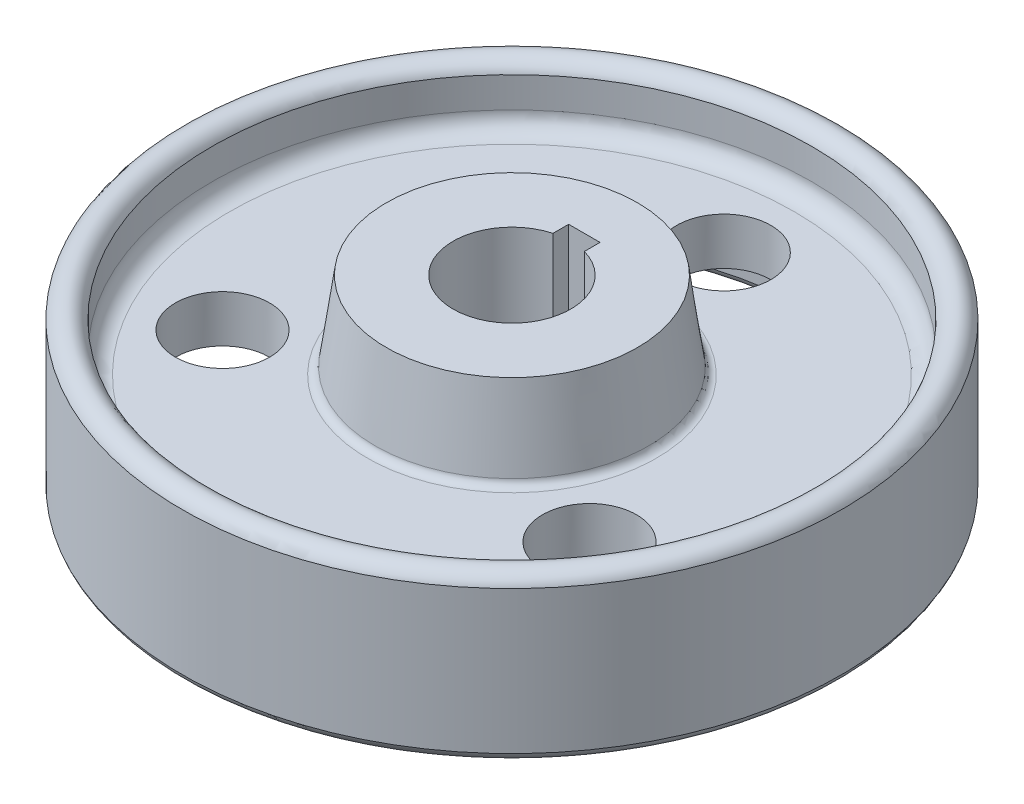
ISO-10303-21;
HEADER;
FILE_DESCRIPTION(('STEP AP214'),'2;1');
FILE_NAME('part.step','',(''),(''),'','','');
FILE_SCHEMA(('AUTOMOTIVE_DESIGN { 1 0 10303 214 1 1 1 1 }'));
ENDSEC;
DATA;
#1=APPLICATION_CONTEXT('core data for automotive mechanical design processes');
#2=APPLICATION_PROTOCOL_DEFINITION('international standard','automotive_design',2000,#1);
#3=PRODUCT_CONTEXT('',#1,'mechanical');
#4=PRODUCT('Part','Part','',(#3));
#5=PRODUCT_RELATED_PRODUCT_CATEGORY('part','',(#4));
#6=PRODUCT_DEFINITION_FORMATION('','',#4);
#7=PRODUCT_DEFINITION_CONTEXT('part definition',#1,'design');
#8=PRODUCT_DEFINITION('design','',#6,#7);
#9=PRODUCT_DEFINITION_SHAPE('','',#8);
#10=(LENGTH_UNIT() NAMED_UNIT(*) SI_UNIT(.MILLI.,.METRE.));
#11=(NAMED_UNIT(*) PLANE_ANGLE_UNIT() SI_UNIT($,.RADIAN.));
#12=(NAMED_UNIT(*) SI_UNIT($,.STERADIAN.) SOLID_ANGLE_UNIT());
#13=UNCERTAINTY_MEASURE_WITH_UNIT(LENGTH_MEASURE(1.E-05),#10,'distance_accuracy_value','');
#14=(GEOMETRIC_REPRESENTATION_CONTEXT(3) GLOBAL_UNCERTAINTY_ASSIGNED_CONTEXT((#13)) GLOBAL_UNIT_ASSIGNED_CONTEXT((#10,
#11,#12)) REPRESENTATION_CONTEXT('',''));
#15=CARTESIAN_POINT('',(0.,0.,0.));
#16=DIRECTION('',(0.,0.,1.));
#17=DIRECTION('',(1.,0.,0.));
#18=AXIS2_PLACEMENT_3D('',#15,#16,#17);
#19=CARTESIAN_POINT('',(0.,-13.4326206780507,0.));
#20=DIRECTION('',(0.,-1.,0.));
#21=DIRECTION('',(0.,0.,-1.));
#22=AXIS2_PLACEMENT_3D('',#19,#20,#21);
#23=TOROIDAL_SURFACE('',#22,63.6699438496003,3.175);
#24=CARTESIAN_POINT('',(0.,-14.4574438496003,0.));
#25=DIRECTION('',(0.,-1.,0.));
#26=DIRECTION('',(0.,0.,-1.));
#27=AXIS2_PLACEMENT_3D('',#24,#25,#26);
#28=CIRCLE('',#27,60.6648876992006);
#29=CARTESIAN_POINT('',(0.,-14.4574438496003,-60.6648876992006));
#30=VERTEX_POINT('',#29);
#31=EDGE_CURVE('E11',#30,#30,#28,.T.);
#32=ORIENTED_EDGE('',*,*,#31,.F.);
#33=EDGE_LOOP('',(#32));
#34=FACE_BOUND('',#33,.T.);
#35=CARTESIAN_POINT('',(0.,-14.4574438496003,0.));
#36=DIRECTION('',(0.,-1.,0.));
#37=DIRECTION('',(0.,0.,-1.));
#38=AXIS2_PLACEMENT_3D('',#35,#36,#37);
#39=CIRCLE('',#38,66.675);
#40=CARTESIAN_POINT('',(0.,-14.4574438496003,-66.675));
#41=VERTEX_POINT('',#40);
#42=EDGE_CURVE('E132',#41,#41,#39,.T.);
#43=ORIENTED_EDGE('',*,*,#42,.T.);
#44=EDGE_LOOP('',(#43));
#45=FACE_BOUND('',#44,.T.);
#46=ADVANCED_FACE('F37',(#34,#45),#23,.T.);
#47=CARTESIAN_POINT('',(0.,0.,0.));
#48=DIRECTION('',(0.,-1.,0.));
#49=DIRECTION('',(0.,0.,-1.));
#50=AXIS2_PLACEMENT_3D('',#47,#48,#49);
#51=CYLINDRICAL_SURFACE('',#50,60.6648876992006);
#52=CARTESIAN_POINT('',(0.,-8.27738769920063,0.));
#53=DIRECTION('',(0.,-1.,0.));
#54=DIRECTION('',(0.,0.,-1.));
#55=AXIS2_PLACEMENT_3D('',#52,#53,#54);
#56=CIRCLE('',#55,60.6648876992006);
#57=CARTESIAN_POINT('',(0.,-8.27738769920063,-60.6648876992006));
#58=VERTEX_POINT('',#57);
#59=EDGE_CURVE('E44',#58,#58,#56,.T.);
#60=ORIENTED_EDGE('',*,*,#59,.F.);
#61=EDGE_LOOP('',(#60));
#62=FACE_BOUND('',#61,.T.);
#63=ORIENTED_EDGE('',*,*,#31,.T.);
#64=EDGE_LOOP('',(#63));
#65=FACE_BOUND('',#64,.T.);
#66=ADVANCED_FACE('F123',(#62,#65),#51,.F.);
#67=CARTESIAN_POINT('',(0.,-8.27738769920063,0.));
#68=DIRECTION('',(0.,-1.,0.));
#69=DIRECTION('',(0.,0.,-1.));
#70=AXIS2_PLACEMENT_3D('',#67,#68,#69);
#71=TOROIDAL_SURFACE('',#70,57.15,3.51488769920063);
#72=ORIENTED_EDGE('',*,*,#59,.T.);
#73=EDGE_LOOP('',(#72));
#74=FACE_BOUND('',#73,.T.);
#75=CARTESIAN_POINT('',(0.,-4.76249999999999,0.));
#76=DIRECTION('',(0.,-1.,0.));
#77=DIRECTION('',(0.,0.,-1.));
#78=AXIS2_PLACEMENT_3D('',#75,#76,#77);
#79=CIRCLE('',#78,57.15);
#80=CARTESIAN_POINT('',(0.,-4.76249999999999,-57.15));
#81=VERTEX_POINT('',#80);
#82=EDGE_CURVE('E115',#81,#81,#79,.T.);
#83=ORIENTED_EDGE('',*,*,#82,.F.);
#84=EDGE_LOOP('',(#83));
#85=FACE_BOUND('',#84,.T.);
#86=ADVANCED_FACE('F120',(#74,#85),#71,.F.);
#87=CARTESIAN_POINT('',(0.,-4.7625,-29.2341870222737));
#88=DIRECTION('',(0.,-1.,0.));
#89=DIRECTION('',(0.,0.,-1.));
#90=AXIS2_PLACEMENT_3D('',#87,#88,#89);
#91=PLANE('',#90);
#92=CARTESIAN_POINT('',(0.,-4.7625,-42.8625));
#93=DIRECTION('',(0.,-1.,0.));
#94=DIRECTION('',(0.,0.,-1.));
#95=AXIS2_PLACEMENT_3D('',#92,#93,#94);
#96=CIRCLE('',#95,9.525);
#97=CARTESIAN_POINT('',(0.,-4.7625,-52.3875));
#98=VERTEX_POINT('',#97);
#99=EDGE_CURVE('E86',#98,#98,#96,.T.);
#100=ORIENTED_EDGE('',*,*,#99,.F.);
#101=EDGE_LOOP('',(#100));
#102=FACE_BOUND('',#101,.T.);
#103=CARTESIAN_POINT('',(-37.1200138697105,-4.7625,21.4312500000001));
#104=DIRECTION('',(0.,-1.,0.));
#105=DIRECTION('',(0.,0.,-1.));
#106=AXIS2_PLACEMENT_3D('',#103,#104,#105);
#107=CIRCLE('',#106,9.525);
#108=CARTESIAN_POINT('',(-37.1200138697105,-4.7625,11.9062500000001));
#109=VERTEX_POINT('',#108);
#110=EDGE_CURVE('E368',#109,#109,#107,.T.);
#111=ORIENTED_EDGE('',*,*,#110,.F.);
#112=EDGE_LOOP('',(#111));
#113=FACE_BOUND('',#112,.T.);
#114=CARTESIAN_POINT('',(37.1200138697105,-4.7625,21.43125));
#115=DIRECTION('',(0.,-1.,0.));
#116=DIRECTION('',(0.,0.,-1.));
#117=AXIS2_PLACEMENT_3D('',#114,#115,#116);
#118=CIRCLE('',#117,9.525);
#119=CARTESIAN_POINT('',(37.1200138697105,-4.7625,11.90625));
#120=VERTEX_POINT('',#119);
#121=EDGE_CURVE('E365',#120,#120,#118,.T.);
#122=ORIENTED_EDGE('',*,*,#121,.F.);
#123=EDGE_LOOP('',(#122));
#124=FACE_BOUND('',#123,.T.);
#125=ORIENTED_EDGE('',*,*,#82,.T.);
#126=EDGE_LOOP('',(#125));
#127=FACE_BOUND('',#126,.T.);
#128=CARTESIAN_POINT('',(0.,-4.76250000000001,0.));
#129=DIRECTION('',(0.,-1.,0.));
#130=DIRECTION('',(0.,0.,-1.));
#131=AXIS2_PLACEMENT_3D('',#128,#129,#130);
#132=CIRCLE('',#131,29.2341870222737);
#133=CARTESIAN_POINT('',(0.,-4.76250000000001,-29.2341870222737));
#134=VERTEX_POINT('',#133);
#135=EDGE_CURVE('E112',#134,#134,#132,.T.);
#136=ORIENTED_EDGE('',*,*,#135,.F.);
#137=EDGE_LOOP('',(#136));
#138=FACE_BOUND('',#137,.T.);
#139=ADVANCED_FACE('F184',(#102,#113,#124,#127,#138),#91,.T.);
#140=CARTESIAN_POINT('',(0.,-6.35000000000002,0.));
#141=DIRECTION('',(0.,-1.,0.));
#142=DIRECTION('',(0.,0.,-1.));
#143=AXIS2_PLACEMENT_3D('',#140,#141,#142);
#144=TOROIDAL_SURFACE('',#143,29.2341870222737,1.58750000000001);
#145=CARTESIAN_POINT('',(0.,-6.12906270222592,0.));
#146=DIRECTION('',(0.,-1.,0.));
#147=DIRECTION('',(0.,0.,-1.));
#148=AXIS2_PLACEMENT_3D('',#145,#146,#147);
#149=CIRCLE('',#148,27.6621364631465);
#150=CARTESIAN_POINT('',(0.,-6.12906270222592,-27.6621364631465));
#151=VERTEX_POINT('',#150);
#152=EDGE_CURVE('E109',#151,#151,#149,.T.);
#153=ORIENTED_EDGE('',*,*,#152,.F.);
#154=EDGE_LOOP('',(#153));
#155=FACE_BOUND('',#154,.T.);
#156=ORIENTED_EDGE('',*,*,#135,.T.);
#157=EDGE_LOOP('',(#156));
#158=FACE_BOUND('',#157,.T.);
#159=ADVANCED_FACE('F180',(#155,#158),#144,.F.);
#160=CARTESIAN_POINT('',(0.,-22.225,0.));
#161=DIRECTION('',(0.,1.,0.));
#162=DIRECTION('',(0.,0.,1.));
#163=AXIS2_PLACEMENT_3D('',#160,#161,#162);
#164=CONICAL_SURFACE('',#163,25.4,0.139626340159544);
#165=ORIENTED_EDGE('',*,*,#152,.T.);
#166=EDGE_LOOP('',(#165));
#167=FACE_BOUND('',#166,.T.);
#168=CARTESIAN_POINT('',(0.,-22.225,0.));
#169=DIRECTION('',(0.,-1.,0.));
#170=DIRECTION('',(0.,0.,-1.));
#171=AXIS2_PLACEMENT_3D('',#168,#169,#170);
#172=CIRCLE('',#171,25.4);
#173=CARTESIAN_POINT('',(0.,-22.225,-25.4));
#174=VERTEX_POINT('',#173);
#175=EDGE_CURVE('E100',#174,#174,#172,.T.);
#176=ORIENTED_EDGE('',*,*,#175,.F.);
#177=EDGE_LOOP('',(#176));
#178=FACE_BOUND('',#177,.T.);
#179=ADVANCED_FACE('F176',(#167,#178),#164,.T.);
#180=CARTESIAN_POINT('',(0.,-22.225,-11.90625));
#181=DIRECTION('',(0.,-1.,0.));
#182=DIRECTION('',(0.,0.,-1.));
#183=AXIS2_PLACEMENT_3D('',#180,#181,#182);
#184=PLANE('',#183);
#185=DIRECTION('',(0.,0.,-1.));
#186=VECTOR('',#185,1.);
#187=CARTESIAN_POINT('',(-3.175,-22.225,-11.90625));
#188=LINE('',#187,#186);
#189=CARTESIAN_POINT('',(-3.175,-22.225,-11.4751106339983));
#190=VERTEX_POINT('',#189);
#191=CARTESIAN_POINT('',(-3.175,-22.225,-14.6501106339983));
#192=VERTEX_POINT('',#191);
#193=EDGE_CURVE('E59',#190,#192,#188,.T.);
#194=ORIENTED_EDGE('',*,*,#193,.F.);
#195=CARTESIAN_POINT('',(0.,-22.225,0.));
#196=DIRECTION('',(0.,-1.,0.));
#197=DIRECTION('',(0.,0.,-1.));
#198=AXIS2_PLACEMENT_3D('',#195,#196,#197);
#199=CIRCLE('',#198,11.90625);
#200=CARTESIAN_POINT('',(3.175,-22.225,-11.4751106339983));
#201=VERTEX_POINT('',#200);
#202=EDGE_CURVE('E94',#201,#190,#199,.T.);
#203=ORIENTED_EDGE('',*,*,#202,.F.);
#204=DIRECTION('',(0.,0.,1.));
#205=VECTOR('',#204,1.);
#206=CARTESIAN_POINT('',(3.175,-22.225,-11.90625));
#207=LINE('',#206,#205);
#208=CARTESIAN_POINT('',(3.175,-22.225,-14.6501106339983));
#209=VERTEX_POINT('',#208);
#210=EDGE_CURVE('E375',#209,#201,#207,.T.);
#211=ORIENTED_EDGE('',*,*,#210,.F.);
#212=DIRECTION('',(1.,0.,0.));
#213=VECTOR('',#212,1.);
#214=CARTESIAN_POINT('',(0.,-22.225,-14.6501106339983));
#215=LINE('',#214,#213);
#216=EDGE_CURVE('E139',#192,#209,#215,.T.);
#217=ORIENTED_EDGE('',*,*,#216,.F.);
#218=EDGE_LOOP('',(#194,#203,#211,#217));
#219=FACE_BOUND('',#218,.T.);
#220=ORIENTED_EDGE('',*,*,#175,.T.);
#221=EDGE_LOOP('',(#220));
#222=FACE_BOUND('',#221,.T.);
#223=ADVANCED_FACE('F170',(#219,#222),#184,.T.);
#224=CARTESIAN_POINT('',(0.,0.,0.));
#225=DIRECTION('',(0.,-1.,0.));
#226=DIRECTION('',(0.,0.,-1.));
#227=AXIS2_PLACEMENT_3D('',#224,#225,#226);
#228=CYLINDRICAL_SURFACE('',#227,11.90625);
#229=ORIENTED_EDGE('',*,*,#202,.T.);
#230=DIRECTION('',(0.,1.,0.));
#231=VECTOR('',#230,1.);
#232=CARTESIAN_POINT('',(-3.175,-104.775,-11.4751106339983));
#233=LINE('',#232,#231);
#234=CARTESIAN_POINT('',(-3.175,22.225,-11.4751106339983));
#235=VERTEX_POINT('',#234);
#236=EDGE_CURVE('E79',#190,#235,#233,.T.);
#237=ORIENTED_EDGE('',*,*,#236,.T.);
#238=CARTESIAN_POINT('',(0.,22.225,0.));
#239=DIRECTION('',(0.,-1.,0.));
#240=DIRECTION('',(0.,0.,-1.));
#241=AXIS2_PLACEMENT_3D('',#238,#239,#240);
#242=CIRCLE('',#241,11.90625);
#243=CARTESIAN_POINT('',(3.175,22.225,-11.4751106339983));
#244=VERTEX_POINT('',#243);
#245=EDGE_CURVE('E92',#244,#235,#242,.T.);
#246=ORIENTED_EDGE('',*,*,#245,.F.);
#247=DIRECTION('',(0.,1.,0.));
#248=VECTOR('',#247,1.);
#249=CARTESIAN_POINT('',(3.175,-104.775,-11.4751106339983));
#250=LINE('',#249,#248);
#251=EDGE_CURVE('E51',#201,#244,#250,.T.);
#252=ORIENTED_EDGE('',*,*,#251,.F.);
#253=EDGE_LOOP('',(#229,#237,#246,#252));
#254=FACE_BOUND('',#253,.T.);
#255=ADVANCED_FACE('F91',(#254),#228,.F.);
#256=CARTESIAN_POINT('',(0.,22.225,-11.90625));
#257=DIRECTION('',(0.,-1.,0.));
#258=DIRECTION('',(0.,0.,-1.));
#259=AXIS2_PLACEMENT_3D('',#256,#257,#258);
#260=PLANE('',#259);
#261=CARTESIAN_POINT('',(0.,22.225,0.));
#262=DIRECTION('',(0.,-1.,0.));
#263=DIRECTION('',(0.,0.,-1.));
#264=AXIS2_PLACEMENT_3D('',#261,#262,#263);
#265=CIRCLE('',#264,25.4);
#266=CARTESIAN_POINT('',(0.,22.225,-25.4));
#267=VERTEX_POINT('',#266);
#268=EDGE_CURVE('E98',#267,#267,#265,.T.);
#269=ORIENTED_EDGE('',*,*,#268,.F.);
#270=EDGE_LOOP('',(#269));
#271=FACE_BOUND('',#270,.T.);
#272=ORIENTED_EDGE('',*,*,#245,.T.);
#273=DIRECTION('',(0.,0.,1.));
#274=VECTOR('',#273,1.);
#275=CARTESIAN_POINT('',(-3.175,22.225,-14.6501106339983));
#276=LINE('',#275,#274);
#277=CARTESIAN_POINT('',(-3.175,22.225,-14.6501106339983));
#278=VERTEX_POINT('',#277);
#279=EDGE_CURVE('E76',#278,#235,#276,.T.);
#280=ORIENTED_EDGE('',*,*,#279,.F.);
#281=DIRECTION('',(-1.,0.,0.));
#282=VECTOR('',#281,1.);
#283=CARTESIAN_POINT('',(-3.175,22.225,-14.6501106339983));
#284=LINE('',#283,#282);
#285=CARTESIAN_POINT('',(3.175,22.225,-14.6501106339983));
#286=VERTEX_POINT('',#285);
#287=EDGE_CURVE('E95',#286,#278,#284,.T.);
#288=ORIENTED_EDGE('',*,*,#287,.F.);
#289=DIRECTION('',(0.,0.,-1.));
#290=VECTOR('',#289,1.);
#291=CARTESIAN_POINT('',(3.175,22.225,-14.6501106339983));
#292=LINE('',#291,#290);
#293=EDGE_CURVE('E85',#244,#286,#292,.T.);
#294=ORIENTED_EDGE('',*,*,#293,.F.);
#295=EDGE_LOOP('',(#272,#280,#288,#294));
#296=FACE_BOUND('',#295,.T.);
#297=ADVANCED_FACE('F97',(#271,#296),#260,.F.);
#298=CARTESIAN_POINT('',(0.,22.225,0.));
#299=DIRECTION('',(0.,-1.,0.));
#300=DIRECTION('',(0.,0.,-1.));
#301=AXIS2_PLACEMENT_3D('',#298,#299,#300);
#302=CONICAL_SURFACE('',#301,25.4,0.139626340159543);
#303=CARTESIAN_POINT('',(0.,6.12906270222591,0.));
#304=DIRECTION('',(0.,-1.,0.));
#305=DIRECTION('',(0.,0.,-1.));
#306=AXIS2_PLACEMENT_3D('',#303,#304,#305);
#307=CIRCLE('',#306,27.6621364631465);
#308=CARTESIAN_POINT('',(0.,6.12906270222591,-27.6621364631465));
#309=VERTEX_POINT('',#308);
#310=EDGE_CURVE('E103',#309,#309,#307,.T.);
#311=ORIENTED_EDGE('',*,*,#310,.F.);
#312=EDGE_LOOP('',(#311));
#313=FACE_BOUND('',#312,.T.);
#314=ORIENTED_EDGE('',*,*,#268,.T.);
#315=EDGE_LOOP('',(#314));
#316=FACE_BOUND('',#315,.T.);
#317=ADVANCED_FACE('F159',(#313,#316),#302,.T.);
#318=CARTESIAN_POINT('',(0.,6.35000000000001,0.));
#319=DIRECTION('',(0.,-1.,0.));
#320=DIRECTION('',(0.,0.,-1.));
#321=AXIS2_PLACEMENT_3D('',#318,#319,#320);
#322=TOROIDAL_SURFACE('',#321,29.2341870222737,1.58750000000001);
#323=ORIENTED_EDGE('',*,*,#310,.T.);
#324=EDGE_LOOP('',(#323));
#325=FACE_BOUND('',#324,.T.);
#326=CARTESIAN_POINT('',(0.,4.76249999999999,0.));
#327=DIRECTION('',(0.,-1.,0.));
#328=DIRECTION('',(0.,0.,-1.));
#329=AXIS2_PLACEMENT_3D('',#326,#327,#328);
#330=CIRCLE('',#329,29.2341870222737);
#331=CARTESIAN_POINT('',(0.,4.76249999999999,-29.2341870222737));
#332=VERTEX_POINT('',#331);
#333=EDGE_CURVE('E151',#332,#332,#330,.T.);
#334=ORIENTED_EDGE('',*,*,#333,.F.);
#335=EDGE_LOOP('',(#334));
#336=FACE_BOUND('',#335,.T.);
#337=ADVANCED_FACE('F156',(#325,#336),#322,.F.);
#338=CARTESIAN_POINT('',(0.,4.7625,-29.2341870222737));
#339=DIRECTION('',(0.,-1.,0.));
#340=DIRECTION('',(0.,0.,-1.));
#341=AXIS2_PLACEMENT_3D('',#338,#339,#340);
#342=PLANE('',#341);
#343=CARTESIAN_POINT('',(0.,4.7625,-42.8625));
#344=DIRECTION('',(0.,1.,0.));
#345=DIRECTION('',(0.,0.,1.));
#346=AXIS2_PLACEMENT_3D('',#343,#344,#345);
#347=CIRCLE('',#346,9.525);
#348=CARTESIAN_POINT('',(0.,4.7625,-33.3375));
#349=VERTEX_POINT('',#348);
#350=EDGE_CURVE('E347',#349,#349,#347,.T.);
#351=ORIENTED_EDGE('',*,*,#350,.F.);
#352=EDGE_LOOP('',(#351));
#353=FACE_BOUND('',#352,.T.);
#354=CARTESIAN_POINT('',(-37.1200138697105,4.7625,21.4312500000001));
#355=DIRECTION('',(0.,1.,0.));
#356=DIRECTION('',(0.,0.,1.));
#357=AXIS2_PLACEMENT_3D('',#354,#355,#356);
#358=CIRCLE('',#357,9.525);
#359=CARTESIAN_POINT('',(-37.1200138697105,4.7625,30.9562500000001));
#360=VERTEX_POINT('',#359);
#361=EDGE_CURVE('E351',#360,#360,#358,.T.);
#362=ORIENTED_EDGE('',*,*,#361,.F.);
#363=EDGE_LOOP('',(#362));
#364=FACE_BOUND('',#363,.T.);
#365=CARTESIAN_POINT('',(37.1200138697105,4.7625,21.43125));
#366=DIRECTION('',(0.,1.,0.));
#367=DIRECTION('',(0.,0.,1.));
#368=AXIS2_PLACEMENT_3D('',#365,#366,#367);
#369=CIRCLE('',#368,9.525);
#370=CARTESIAN_POINT('',(37.1200138697105,4.7625,30.95625));
#371=VERTEX_POINT('',#370);
#372=EDGE_CURVE('E355',#371,#371,#369,.T.);
#373=ORIENTED_EDGE('',*,*,#372,.F.);
#374=EDGE_LOOP('',(#373));
#375=FACE_BOUND('',#374,.T.);
#376=CARTESIAN_POINT('',(0.,4.7625,0.));
#377=DIRECTION('',(0.,-1.,0.));
#378=DIRECTION('',(0.,0.,-1.));
#379=AXIS2_PLACEMENT_3D('',#376,#377,#378);
#380=CIRCLE('',#379,57.15);
#381=CARTESIAN_POINT('',(0.,4.7625,-57.15));
#382=VERTEX_POINT('',#381);
#383=EDGE_CURVE('E148',#382,#382,#380,.T.);
#384=ORIENTED_EDGE('',*,*,#383,.F.);
#385=EDGE_LOOP('',(#384));
#386=FACE_BOUND('',#385,.T.);
#387=ORIENTED_EDGE('',*,*,#333,.T.);
#388=EDGE_LOOP('',(#387));
#389=FACE_BOUND('',#388,.T.);
#390=ADVANCED_FACE('F302',(#353,#364,#375,#386,#389),#342,.F.);
#391=CARTESIAN_POINT('',(0.,8.27738769920063,0.));
#392=DIRECTION('',(0.,-1.,0.));
#393=DIRECTION('',(0.,0.,-1.));
#394=AXIS2_PLACEMENT_3D('',#391,#392,#393);
#395=TOROIDAL_SURFACE('',#394,57.15,3.51488769920063);
#396=CARTESIAN_POINT('',(0.,8.27738769920063,0.));
#397=DIRECTION('',(0.,-1.,0.));
#398=DIRECTION('',(0.,0.,-1.));
#399=AXIS2_PLACEMENT_3D('',#396,#397,#398);
#400=CIRCLE('',#399,60.6648876992006);
#401=CARTESIAN_POINT('',(0.,8.27738769920063,-60.6648876992006));
#402=VERTEX_POINT('',#401);
#403=EDGE_CURVE('E145',#402,#402,#400,.T.);
#404=ORIENTED_EDGE('',*,*,#403,.F.);
#405=EDGE_LOOP('',(#404));
#406=FACE_BOUND('',#405,.T.);
#407=ORIENTED_EDGE('',*,*,#383,.T.);
#408=EDGE_LOOP('',(#407));
#409=FACE_BOUND('',#408,.T.);
#410=ADVANCED_FACE('F298',(#406,#409),#395,.F.);
#411=CARTESIAN_POINT('',(0.,0.,0.));
#412=DIRECTION('',(0.,-1.,0.));
#413=DIRECTION('',(0.,0.,-1.));
#414=AXIS2_PLACEMENT_3D('',#411,#412,#413);
#415=CYLINDRICAL_SURFACE('',#414,60.6648876992006);
#416=ORIENTED_EDGE('',*,*,#403,.T.);
#417=EDGE_LOOP('',(#416));
#418=FACE_BOUND('',#417,.T.);
#419=CARTESIAN_POINT('',(0.,14.4574438496003,0.));
#420=DIRECTION('',(0.,-1.,0.));
#421=DIRECTION('',(0.,0.,-1.));
#422=AXIS2_PLACEMENT_3D('',#419,#420,#421);
#423=CIRCLE('',#422,60.6648876992006);
#424=CARTESIAN_POINT('',(0.,14.4574438496003,-60.6648876992006));
#425=VERTEX_POINT('',#424);
#426=EDGE_CURVE('E137',#425,#425,#423,.T.);
#427=ORIENTED_EDGE('',*,*,#426,.F.);
#428=EDGE_LOOP('',(#427));
#429=FACE_BOUND('',#428,.T.);
#430=ADVANCED_FACE('F294',(#418,#429),#415,.F.);
#431=CARTESIAN_POINT('',(0.,13.4326206780507,0.));
#432=DIRECTION('',(0.,-1.,0.));
#433=DIRECTION('',(0.,0.,-1.));
#434=AXIS2_PLACEMENT_3D('',#431,#432,#433);
#435=TOROIDAL_SURFACE('',#434,63.6699438496003,3.175);
#436=ORIENTED_EDGE('',*,*,#426,.T.);
#437=EDGE_LOOP('',(#436));
#438=FACE_BOUND('',#437,.T.);
#439=CARTESIAN_POINT('',(0.,14.4574438496003,0.));
#440=DIRECTION('',(0.,-1.,0.));
#441=DIRECTION('',(0.,0.,-1.));
#442=AXIS2_PLACEMENT_3D('',#439,#440,#441);
#443=CIRCLE('',#442,66.675);
#444=CARTESIAN_POINT('',(0.,14.4574438496003,-66.675));
#445=VERTEX_POINT('',#444);
#446=EDGE_CURVE('E134',#445,#445,#443,.T.);
#447=ORIENTED_EDGE('',*,*,#446,.F.);
#448=EDGE_LOOP('',(#447));
#449=FACE_BOUND('',#448,.T.);
#450=ADVANCED_FACE('F290',(#438,#449),#435,.T.);
#451=CARTESIAN_POINT('',(0.,0.,0.));
#452=DIRECTION('',(0.,-1.,0.));
#453=DIRECTION('',(0.,0.,-1.));
#454=AXIS2_PLACEMENT_3D('',#451,#452,#453);
#455=CYLINDRICAL_SURFACE('',#454,66.675);
#456=ORIENTED_EDGE('',*,*,#446,.T.);
#457=EDGE_LOOP('',(#456));
#458=FACE_BOUND('',#457,.T.);
#459=ORIENTED_EDGE('',*,*,#42,.F.);
#460=EDGE_LOOP('',(#459));
#461=FACE_BOUND('',#460,.T.);
#462=ADVANCED_FACE('F233',(#458,#461),#455,.T.);
#463=CARTESIAN_POINT('',(-3.175,-104.775,-14.6501106339983));
#464=DIRECTION('',(-1.,0.,0.));
#465=DIRECTION('',(0.,0.,1.));
#466=AXIS2_PLACEMENT_3D('',#463,#464,#465);
#467=PLANE('',#466);
#468=ORIENTED_EDGE('',*,*,#193,.T.);
#469=DIRECTION('',(0.,1.,0.));
#470=VECTOR('',#469,1.);
#471=CARTESIAN_POINT('',(-3.175,-104.775,-14.6501106339983));
#472=LINE('',#471,#470);
#473=EDGE_CURVE('E80',#192,#278,#472,.T.);
#474=ORIENTED_EDGE('',*,*,#473,.T.);
#475=ORIENTED_EDGE('',*,*,#279,.T.);
#476=ORIENTED_EDGE('',*,*,#236,.F.);
#477=EDGE_LOOP('',(#468,#474,#475,#476));
#478=FACE_BOUND('',#477,.T.);
#479=ADVANCED_FACE('F78',(#478),#467,.F.);
#480=CARTESIAN_POINT('',(-3.175,-104.775,-14.6501106339983));
#481=DIRECTION('',(0.,0.,-1.));
#482=DIRECTION('',(-1.,0.,0.));
#483=AXIS2_PLACEMENT_3D('',#480,#481,#482);
#484=PLANE('',#483);
#485=ORIENTED_EDGE('',*,*,#216,.T.);
#486=DIRECTION('',(0.,1.,0.));
#487=VECTOR('',#486,1.);
#488=CARTESIAN_POINT('',(3.175,-104.775,-14.6501106339983));
#489=LINE('',#488,#487);
#490=EDGE_CURVE('E376',#209,#286,#489,.T.);
#491=ORIENTED_EDGE('',*,*,#490,.T.);
#492=ORIENTED_EDGE('',*,*,#287,.T.);
#493=ORIENTED_EDGE('',*,*,#473,.F.);
#494=EDGE_LOOP('',(#485,#491,#492,#493));
#495=FACE_BOUND('',#494,.T.);
#496=ADVANCED_FACE('F232',(#495),#484,.F.);
#497=CARTESIAN_POINT('',(3.175,-104.775,-14.6501106339983));
#498=DIRECTION('',(1.,0.,0.));
#499=DIRECTION('',(0.,0.,-1.));
#500=AXIS2_PLACEMENT_3D('',#497,#498,#499);
#501=PLANE('',#500);
#502=ORIENTED_EDGE('',*,*,#210,.T.);
#503=ORIENTED_EDGE('',*,*,#251,.T.);
#504=ORIENTED_EDGE('',*,*,#293,.T.);
#505=ORIENTED_EDGE('',*,*,#490,.F.);
#506=EDGE_LOOP('',(#502,#503,#504,#505));
#507=FACE_BOUND('',#506,.T.);
#508=ADVANCED_FACE('F243',(#507),#501,.F.);
#509=CARTESIAN_POINT('',(37.1200138697105,-122.2375,21.43125));
#510=DIRECTION('',(0.,1.,0.));
#511=DIRECTION('',(0.,0.,1.));
#512=AXIS2_PLACEMENT_3D('',#509,#510,#511);
#513=CYLINDRICAL_SURFACE('',#512,9.525);
#514=ORIENTED_EDGE('',*,*,#121,.T.);
#515=EDGE_LOOP('',(#514));
#516=FACE_BOUND('',#515,.T.);
#517=ORIENTED_EDGE('',*,*,#372,.T.);
#518=EDGE_LOOP('',(#517));
#519=FACE_BOUND('',#518,.T.);
#520=ADVANCED_FACE('F252',(#516,#519),#513,.F.);
#521=CARTESIAN_POINT('',(-37.1200138697105,-122.2375,21.4312500000001));
#522=DIRECTION('',(0.,1.,0.));
#523=DIRECTION('',(0.,0.,1.));
#524=AXIS2_PLACEMENT_3D('',#521,#522,#523);
#525=CYLINDRICAL_SURFACE('',#524,9.525);
#526=ORIENTED_EDGE('',*,*,#110,.T.);
#527=EDGE_LOOP('',(#526));
#528=FACE_BOUND('',#527,.T.);
#529=ORIENTED_EDGE('',*,*,#361,.T.);
#530=EDGE_LOOP('',(#529));
#531=FACE_BOUND('',#530,.T.);
#532=ADVANCED_FACE('F262',(#528,#531),#525,.F.);
#533=CARTESIAN_POINT('',(0.,-122.2375,-42.8625));
#534=DIRECTION('',(0.,1.,0.));
#535=DIRECTION('',(0.,0.,1.));
#536=AXIS2_PLACEMENT_3D('',#533,#534,#535);
#537=CYLINDRICAL_SURFACE('',#536,9.525);
#538=ORIENTED_EDGE('',*,*,#99,.T.);
#539=EDGE_LOOP('',(#538));
#540=FACE_BOUND('',#539,.T.);
#541=ORIENTED_EDGE('',*,*,#350,.T.);
#542=EDGE_LOOP('',(#541));
#543=FACE_BOUND('',#542,.T.);
#544=ADVANCED_FACE('F269',(#540,#543),#537,.F.);
#545=CLOSED_SHELL('',(#46,#66,#86,#139,#159,#179,#223,#255,#297,#317,#337,#390,#410,#430,#450,
#462,#479,#496,#508,#520,#532,#544));
#546=MANIFOLD_SOLID_BREP('B2',#545);
#547=ADVANCED_BREP_SHAPE_REPRESENTATION('',(#18,#546),#14);
#548=SHAPE_DEFINITION_REPRESENTATION(#9,#547);
ENDSEC;
END-ISO-10303-21;
